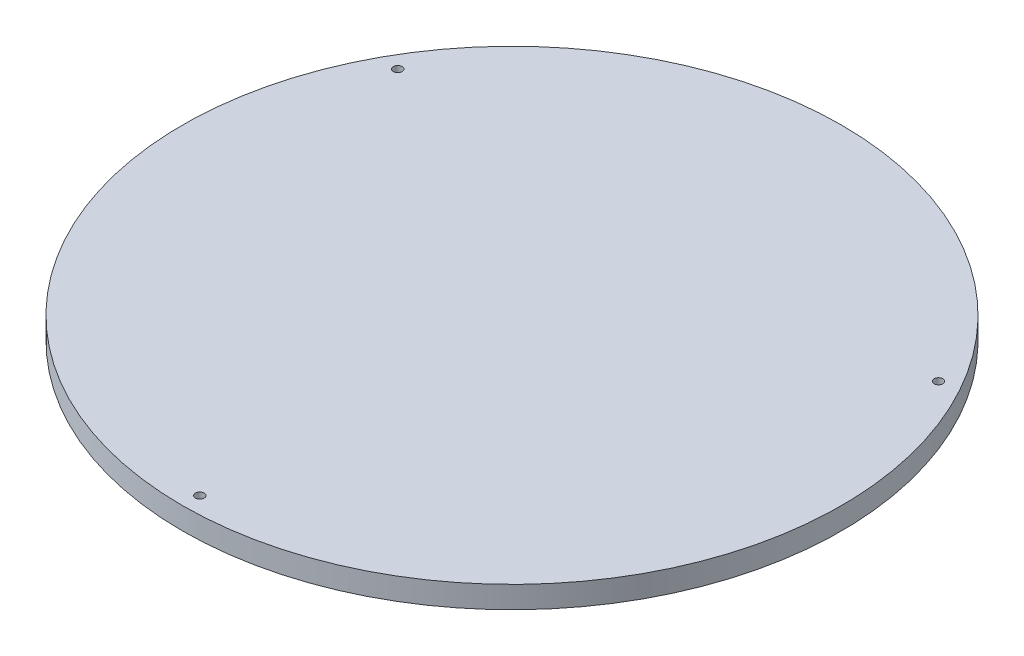
ISO-10303-21;
HEADER;
FILE_DESCRIPTION(('STEP AP214'),'2;1');
FILE_NAME('part.step','',(''),(''),'','','');
FILE_SCHEMA(('AUTOMOTIVE_DESIGN { 1 0 10303 214 1 1 1 1 }'));
ENDSEC;
DATA;
#1=APPLICATION_CONTEXT('core data for automotive mechanical design processes');
#2=APPLICATION_PROTOCOL_DEFINITION('international standard','automotive_design',2000,#1);
#3=PRODUCT_CONTEXT('',#1,'mechanical');
#4=PRODUCT('Part','Part','',(#3));
#5=PRODUCT_RELATED_PRODUCT_CATEGORY('part','',(#4));
#6=PRODUCT_DEFINITION_FORMATION('','',#4);
#7=PRODUCT_DEFINITION_CONTEXT('part definition',#1,'design');
#8=PRODUCT_DEFINITION('design','',#6,#7);
#9=PRODUCT_DEFINITION_SHAPE('','',#8);
#10=(LENGTH_UNIT() NAMED_UNIT(*) SI_UNIT(.MILLI.,.METRE.));
#11=(NAMED_UNIT(*) PLANE_ANGLE_UNIT() SI_UNIT($,.RADIAN.));
#12=(NAMED_UNIT(*) SI_UNIT($,.STERADIAN.) SOLID_ANGLE_UNIT());
#13=UNCERTAINTY_MEASURE_WITH_UNIT(LENGTH_MEASURE(1.E-05),#10,'distance_accuracy_value','');
#14=(GEOMETRIC_REPRESENTATION_CONTEXT(3) GLOBAL_UNCERTAINTY_ASSIGNED_CONTEXT((#13)) GLOBAL_UNIT_ASSIGNED_CONTEXT((#10,
#11,#12)) REPRESENTATION_CONTEXT('',''));
#15=CARTESIAN_POINT('',(0.,0.,0.));
#16=DIRECTION('',(0.,0.,1.));
#17=DIRECTION('',(1.,0.,0.));
#18=AXIS2_PLACEMENT_3D('',#15,#16,#17);
#19=CARTESIAN_POINT('',(0.,10.,0.));
#20=DIRECTION('',(0.,-1.,0.));
#21=DIRECTION('',(0.,0.,-1.));
#22=AXIS2_PLACEMENT_3D('',#19,#20,#21);
#23=CYLINDRICAL_SURFACE('',#22,150.);
#24=CARTESIAN_POINT('',(0.,10.,0.));
#25=DIRECTION('',(0.,1.,0.));
#26=DIRECTION('',(0.,0.,1.));
#27=AXIS2_PLACEMENT_3D('',#24,#25,#26);
#28=CIRCLE('',#27,150.);
#29=CARTESIAN_POINT('',(0.,10.,150.));
#30=VERTEX_POINT('',#29);
#31=EDGE_CURVE('E10',#30,#30,#28,.T.);
#32=ORIENTED_EDGE('',*,*,#31,.F.);
#33=EDGE_LOOP('',(#32));
#34=FACE_BOUND('',#33,.T.);
#35=CARTESIAN_POINT('',(0.,0.,0.));
#36=DIRECTION('',(0.,1.,0.));
#37=DIRECTION('',(0.,0.,1.));
#38=AXIS2_PLACEMENT_3D('',#35,#36,#37);
#39=CIRCLE('',#38,150.);
#40=CARTESIAN_POINT('',(0.,0.,150.));
#41=VERTEX_POINT('',#40);
#42=EDGE_CURVE('E48',#41,#41,#39,.T.);
#43=ORIENTED_EDGE('',*,*,#42,.T.);
#44=EDGE_LOOP('',(#43));
#45=FACE_BOUND('',#44,.T.);
#46=ADVANCED_FACE('F45',(#34,#45),#23,.T.);
#47=CARTESIAN_POINT('',(0.,10.,0.));
#48=DIRECTION('',(0.,1.,0.));
#49=DIRECTION('',(0.,0.,1.));
#50=AXIS2_PLACEMENT_3D('',#47,#48,#49);
#51=PLANE('',#50);
#52=CARTESIAN_POINT('',(-123.062136007708,10.,-71.0499573511008));
#53=DIRECTION('',(0.,1.,0.));
#54=DIRECTION('',(0.,0.,1.));
#55=AXIS2_PLACEMENT_3D('',#52,#53,#54);
#56=CIRCLE('',#55,2.);
#57=CARTESIAN_POINT('',(-123.062136007708,10.,-69.0499573511008));
#58=VERTEX_POINT('',#57);
#59=EDGE_CURVE('E75',#58,#58,#56,.T.);
#60=ORIENTED_EDGE('',*,*,#59,.F.);
#61=EDGE_LOOP('',(#60));
#62=FACE_BOUND('',#61,.T.);
#63=CARTESIAN_POINT('',(123.062136007708,10.,-71.0499573511111));
#64=DIRECTION('',(0.,1.,0.));
#65=DIRECTION('',(0.,0.,1.));
#66=AXIS2_PLACEMENT_3D('',#63,#64,#65);
#67=CIRCLE('',#66,2.00000000001081);
#68=CARTESIAN_POINT('',(123.062136007708,10.,-69.0499573511003));
#69=VERTEX_POINT('',#68);
#70=EDGE_CURVE('E71',#69,#69,#67,.T.);
#71=ORIENTED_EDGE('',*,*,#70,.F.);
#72=EDGE_LOOP('',(#71));
#73=FACE_BOUND('',#72,.T.);
#74=CARTESIAN_POINT('',(9.14770273707526E-12,10.,142.099914702196));
#75=DIRECTION('',(0.,1.,0.));
#76=DIRECTION('',(0.,0.,1.));
#77=AXIS2_PLACEMENT_3D('',#74,#75,#76);
#78=CIRCLE('',#77,2.00000000000428);
#79=CARTESIAN_POINT('',(9.14770273707526E-12,10.,144.099914702201));
#80=VERTEX_POINT('',#79);
#81=EDGE_CURVE('E63',#80,#80,#78,.T.);
#82=ORIENTED_EDGE('',*,*,#81,.F.);
#83=EDGE_LOOP('',(#82));
#84=FACE_BOUND('',#83,.T.);
#85=ORIENTED_EDGE('',*,*,#31,.T.);
#86=EDGE_LOOP('',(#85));
#87=FACE_BOUND('',#86,.T.);
#88=ADVANCED_FACE('F93',(#62,#73,#84,#87),#51,.T.);
#89=CARTESIAN_POINT('',(0.,0.,0.));
#90=DIRECTION('',(0.,1.,0.));
#91=DIRECTION('',(0.,0.,1.));
#92=AXIS2_PLACEMENT_3D('',#89,#90,#91);
#93=PLANE('',#92);
#94=CARTESIAN_POINT('',(-123.062136007708,0.,-71.0499573511008));
#95=DIRECTION('',(0.,1.,0.));
#96=DIRECTION('',(0.,0.,1.));
#97=AXIS2_PLACEMENT_3D('',#94,#95,#96);
#98=CIRCLE('',#97,2.);
#99=CARTESIAN_POINT('',(-123.062136007708,0.,-69.0499573511008));
#100=VERTEX_POINT('',#99);
#101=EDGE_CURVE('E57',#100,#100,#98,.T.);
#102=ORIENTED_EDGE('',*,*,#101,.T.);
#103=EDGE_LOOP('',(#102));
#104=FACE_BOUND('',#103,.T.);
#105=CARTESIAN_POINT('',(123.062136007708,0.,-71.0499573511111));
#106=DIRECTION('',(0.,1.,0.));
#107=DIRECTION('',(0.,0.,1.));
#108=AXIS2_PLACEMENT_3D('',#105,#106,#107);
#109=CIRCLE('',#108,2.00000000001081);
#110=CARTESIAN_POINT('',(123.062136007708,0.,-69.0499573511003));
#111=VERTEX_POINT('',#110);
#112=EDGE_CURVE('E67',#111,#111,#109,.T.);
#113=ORIENTED_EDGE('',*,*,#112,.T.);
#114=EDGE_LOOP('',(#113));
#115=FACE_BOUND('',#114,.T.);
#116=CARTESIAN_POINT('',(9.14770273707526E-12,0.,142.099914702196));
#117=DIRECTION('',(0.,1.,0.));
#118=DIRECTION('',(0.,0.,1.));
#119=AXIS2_PLACEMENT_3D('',#116,#117,#118);
#120=CIRCLE('',#119,2.00000000000428);
#121=CARTESIAN_POINT('',(9.14770273707526E-12,0.,144.099914702201));
#122=VERTEX_POINT('',#121);
#123=EDGE_CURVE('E59',#122,#122,#120,.T.);
#124=ORIENTED_EDGE('',*,*,#123,.T.);
#125=EDGE_LOOP('',(#124));
#126=FACE_BOUND('',#125,.T.);
#127=ORIENTED_EDGE('',*,*,#42,.F.);
#128=EDGE_LOOP('',(#127));
#129=FACE_BOUND('',#128,.T.);
#130=ADVANCED_FACE('F83',(#104,#115,#126,#129),#93,.F.);
#131=CARTESIAN_POINT('',(9.14770273707526E-12,0.,142.099914702196));
#132=DIRECTION('',(0.,1.,0.));
#133=DIRECTION('',(0.,0.,1.));
#134=AXIS2_PLACEMENT_3D('',#131,#132,#133);
#135=CYLINDRICAL_SURFACE('',#134,2.00000000000428);
#136=ORIENTED_EDGE('',*,*,#123,.F.);
#137=EDGE_LOOP('',(#136));
#138=FACE_BOUND('',#137,.T.);
#139=ORIENTED_EDGE('',*,*,#81,.T.);
#140=EDGE_LOOP('',(#139));
#141=FACE_BOUND('',#140,.T.);
#142=ADVANCED_FACE('F101',(#138,#141),#135,.F.);
#143=CARTESIAN_POINT('',(123.062136007708,0.,-71.0499573511111));
#144=DIRECTION('',(0.,1.,0.));
#145=DIRECTION('',(0.,0.,1.));
#146=AXIS2_PLACEMENT_3D('',#143,#144,#145);
#147=CYLINDRICAL_SURFACE('',#146,2.00000000001081);
#148=ORIENTED_EDGE('',*,*,#112,.F.);
#149=EDGE_LOOP('',(#148));
#150=FACE_BOUND('',#149,.T.);
#151=ORIENTED_EDGE('',*,*,#70,.T.);
#152=EDGE_LOOP('',(#151));
#153=FACE_BOUND('',#152,.T.);
#154=ADVANCED_FACE('F89',(#150,#153),#147,.F.);
#155=CARTESIAN_POINT('',(-123.062136007708,0.,-71.0499573511008));
#156=DIRECTION('',(0.,1.,0.));
#157=DIRECTION('',(0.,0.,1.));
#158=AXIS2_PLACEMENT_3D('',#155,#156,#157);
#159=CYLINDRICAL_SURFACE('',#158,2.);
#160=ORIENTED_EDGE('',*,*,#101,.F.);
#161=EDGE_LOOP('',(#160));
#162=FACE_BOUND('',#161,.T.);
#163=ORIENTED_EDGE('',*,*,#59,.T.);
#164=EDGE_LOOP('',(#163));
#165=FACE_BOUND('',#164,.T.);
#166=ADVANCED_FACE('F86',(#162,#165),#159,.F.);
#167=CLOSED_SHELL('',(#46,#88,#130,#142,#154,#166));
#168=MANIFOLD_SOLID_BREP('B2',#167);
#169=ADVANCED_BREP_SHAPE_REPRESENTATION('',(#18,#168),#14);
#170=SHAPE_DEFINITION_REPRESENTATION(#9,#169);
ENDSEC;
END-ISO-10303-21;
